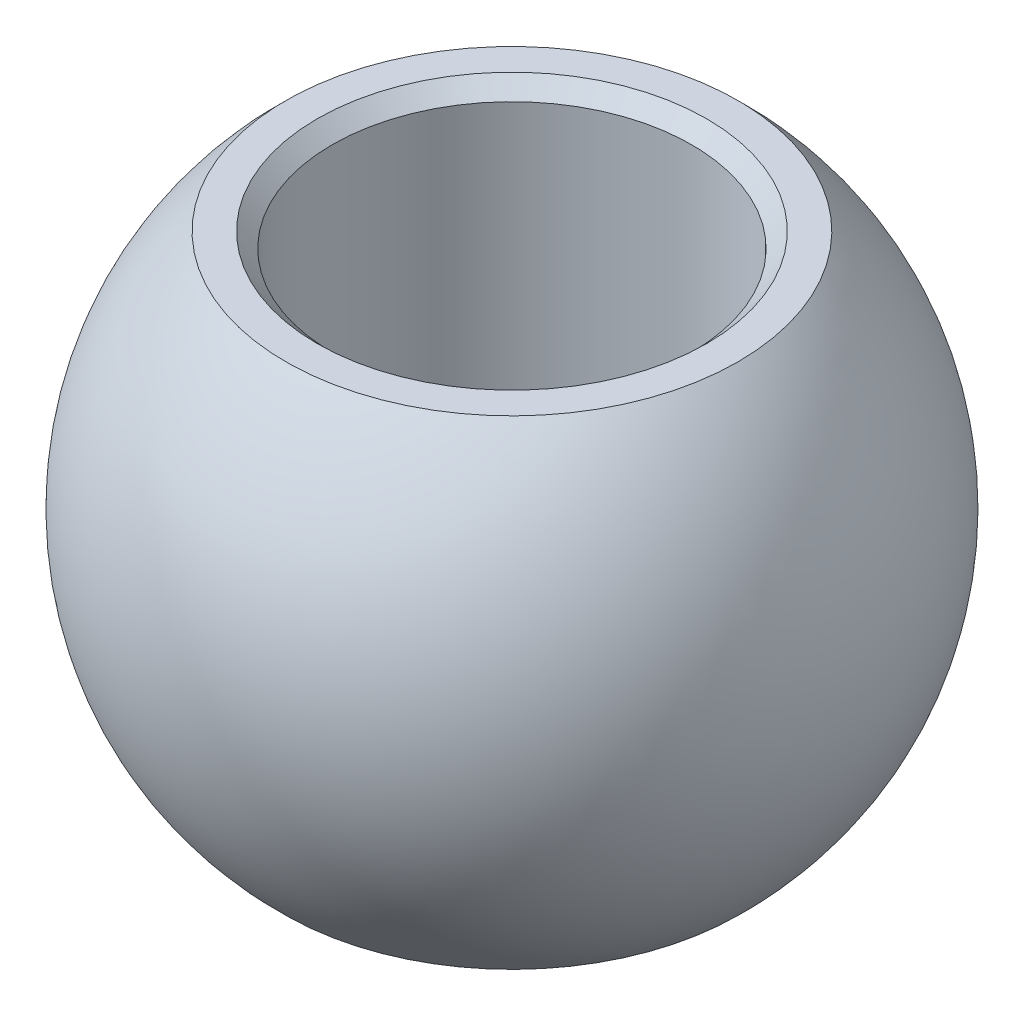
ISO-10303-21;
HEADER;
FILE_DESCRIPTION(('STEP AP214'),'2;1');
FILE_NAME('part.step','',(''),(''),'','','');
FILE_SCHEMA(('AUTOMOTIVE_DESIGN { 1 0 10303 214 1 1 1 1 }'));
ENDSEC;
DATA;
#1=APPLICATION_CONTEXT('core data for automotive mechanical design processes');
#2=APPLICATION_PROTOCOL_DEFINITION('international standard','automotive_design',2000,#1);
#3=PRODUCT_CONTEXT('',#1,'mechanical');
#4=PRODUCT('Part','Part','',(#3));
#5=PRODUCT_RELATED_PRODUCT_CATEGORY('part','',(#4));
#6=PRODUCT_DEFINITION_FORMATION('','',#4);
#7=PRODUCT_DEFINITION_CONTEXT('part definition',#1,'design');
#8=PRODUCT_DEFINITION('design','',#6,#7);
#9=PRODUCT_DEFINITION_SHAPE('','',#8);
#10=(LENGTH_UNIT() NAMED_UNIT(*) SI_UNIT(.MILLI.,.METRE.));
#11=(NAMED_UNIT(*) PLANE_ANGLE_UNIT() SI_UNIT($,.RADIAN.));
#12=(NAMED_UNIT(*) SI_UNIT($,.STERADIAN.) SOLID_ANGLE_UNIT());
#13=UNCERTAINTY_MEASURE_WITH_UNIT(LENGTH_MEASURE(1.E-05),#10,'distance_accuracy_value','');
#14=(GEOMETRIC_REPRESENTATION_CONTEXT(3) GLOBAL_UNCERTAINTY_ASSIGNED_CONTEXT((#13)) GLOBAL_UNIT_ASSIGNED_CONTEXT((#10,
#11,#12)) REPRESENTATION_CONTEXT('',''));
#15=CARTESIAN_POINT('',(0.,0.,0.));
#16=DIRECTION('',(0.,0.,1.));
#17=DIRECTION('',(1.,0.,0.));
#18=AXIS2_PLACEMENT_3D('',#15,#16,#17);
#19=CARTESIAN_POINT('',(0.,0.,0.));
#20=DIRECTION('',(0.,1.,0.));
#21=DIRECTION('',(1.,0.,0.));
#22=AXIS2_PLACEMENT_3D('',#19,#20,#21);
#23=SPHERICAL_SURFACE('',#22,7.33333333333333);
#24=CARTESIAN_POINT('',(0.,5.33333333333333,0.));
#25=DIRECTION('',(0.,1.,0.));
#26=DIRECTION('',(-1.,0.,0.));
#27=AXIS2_PLACEMENT_3D('',#24,#25,#26);
#28=CIRCLE('',#27,5.03322295684717);
#29=CARTESIAN_POINT('',(5.03322295684717,5.33333333333333,0.));
#30=VERTEX_POINT('',#29);
#31=EDGE_CURVE('E59',#30,#30,#28,.F.);
#32=CARTESIAN_POINT('',(0.,-5.33333333333334,0.));
#33=DIRECTION('',(0.,-1.,0.));
#34=DIRECTION('',(1.,0.,0.));
#35=AXIS2_PLACEMENT_3D('',#32,#33,#34);
#36=CIRCLE('',#35,5.03322295684716);
#37=CARTESIAN_POINT('',(5.03322295684716,-5.33333333333334,0.));
#38=VERTEX_POINT('',#37);
#39=EDGE_CURVE('E56',#38,#38,#36,.F.);
#40=CARTESIAN_POINT('',(5.03322295684717,5.33333333333333,0.));
#41=CARTESIAN_POINT('',(5.12370729712082,5.24794465436394,0.));
#42=CARTESIAN_POINT('',(5.21201444918314,5.1602493485395,0.));
#43=CARTESIAN_POINT('',(5.38405501510945,4.98048154321564,0.));
#44=CARTESIAN_POINT('',(5.46778842897344,4.88840904371623,0.));
#45=CARTESIAN_POINT('',(5.63046215672741,4.70012291107757,0.));
#46=CARTESIAN_POINT('',(5.70940247061739,4.60390927793834,0.));
#47=CARTESIAN_POINT('',(5.86228622410797,4.40759070061553,0.));
#48=CARTESIAN_POINT('',(5.93622966370857,4.30748575643195,0.));
#49=CARTESIAN_POINT('',(6.07892798509344,4.10364364368701,0.));
#50=CARTESIAN_POINT('',(6.14768286687771,3.99990647512565,0.));
#51=CARTESIAN_POINT('',(6.27982605466683,3.78906862536363,0.));
#52=CARTESIAN_POINT('',(6.34321436067168,3.68196794416298,0.));
#53=CARTESIAN_POINT('',(6.46446021660551,3.4646804334808,0.));
#54=CARTESIAN_POINT('',(6.52231776653449,3.35449360399926,0.));
#55=CARTESIAN_POINT('',(6.63235227031348,3.13131916949069,0.));
#56=CARTESIAN_POINT('',(6.68452922416349,3.01833156446365,0.));
#57=CARTESIAN_POINT('',(6.78306740339583,2.78984820104496,0.));
#58=CARTESIAN_POINT('',(6.82942862877816,2.67435244265331,0.));
#59=CARTESIAN_POINT('',(6.91621528183446,2.44115189159852,0.));
#60=CARTESIAN_POINT('',(6.95664070950845,2.32344709893537,0.));
#61=CARTESIAN_POINT('',(7.03145107052968,2.0861333192383,0.));
#62=CARTESIAN_POINT('',(7.06583600387693,1.96652433220438,0.));
#63=CARTESIAN_POINT('',(7.12847632379813,1.72571193536068,0.));
#64=CARTESIAN_POINT('',(7.15673171037209,1.6045085255509,0.));
#65=CARTESIAN_POINT('',(7.20703975899918,1.36082118407451,0.));
#66=CARTESIAN_POINT('',(7.22909242105232,1.2383372524079,0.));
#67=CARTESIAN_POINT('',(7.26693790713874,0.992406084526204,0.));
#68=CARTESIAN_POINT('',(7.28273073117203,0.868958848311121,0.));
#69=CARTESIAN_POINT('',(7.30801563987693,0.621420783471637,0.));
#70=CARTESIAN_POINT('',(7.31750772454855,0.497329954847236,0.));
#71=CARTESIAN_POINT('',(7.33016657127675,0.248826084148555,0.));
#72=CARTESIAN_POINT('',(7.33333333333333,0.124413042074274,0.));
#73=CARTESIAN_POINT('',(7.33333333333333,-0.124413042074287,0.));
#74=CARTESIAN_POINT('',(7.33016657127675,-0.248826084148568,0.));
#75=CARTESIAN_POINT('',(7.31750772454855,-0.497329954847249,0.));
#76=CARTESIAN_POINT('',(7.30801563987693,-0.62142078347165,0.));
#77=CARTESIAN_POINT('',(7.28273073117202,-0.868958848311134,0.));
#78=CARTESIAN_POINT('',(7.26693790713874,-0.992406084526217,0.));
#79=CARTESIAN_POINT('',(7.22909242105232,-1.23833725240791,0.));
#80=CARTESIAN_POINT('',(7.20703975899918,-1.36082118407452,0.));
#81=CARTESIAN_POINT('',(7.15673171037208,-1.60450852555091,0.));
#82=CARTESIAN_POINT('',(7.12847632379813,-1.72571193536069,0.));
#83=CARTESIAN_POINT('',(7.06583600387693,-1.96652433220439,0.));
#84=CARTESIAN_POINT('',(7.03145107052968,-2.08613331923832,0.));
#85=CARTESIAN_POINT('',(6.95664070950844,-2.32344709893539,0.));
#86=CARTESIAN_POINT('',(6.91621528183446,-2.44115189159853,0.));
#87=CARTESIAN_POINT('',(6.82942862877815,-2.67435244265332,0.));
#88=CARTESIAN_POINT('',(6.78306740339583,-2.78984820104497,0.));
#89=CARTESIAN_POINT('',(6.68452922416349,-3.01833156446366,0.));
#90=CARTESIAN_POINT('',(6.63235227031347,-3.1313191694907,0.));
#91=CARTESIAN_POINT('',(6.52231776653448,-3.35449360399928,0.));
#92=CARTESIAN_POINT('',(6.4644602166055,-3.46468043348081,0.));
#93=CARTESIAN_POINT('',(6.34321436067168,-3.68196794416299,0.));
#94=CARTESIAN_POINT('',(6.27982605466682,-3.78906862536365,0.));
#95=CARTESIAN_POINT('',(6.1476828668777,-3.99990647512566,0.));
#96=CARTESIAN_POINT('',(6.07892798509343,-4.10364364368702,0.));
#97=CARTESIAN_POINT('',(5.93622966370856,-4.30748575643196,0.));
#98=CARTESIAN_POINT('',(5.86228622410797,-4.40759070061554,0.));
#99=CARTESIAN_POINT('',(5.70940247061738,-4.60390927793835,0.));
#100=CARTESIAN_POINT('',(5.6304621567274,-4.70012291107758,0.));
#101=CARTESIAN_POINT('',(5.46778842897343,-4.88840904371624,0.));
#102=CARTESIAN_POINT('',(5.38405501510944,-4.98048154321565,0.));
#103=CARTESIAN_POINT('',(5.21201444918314,-5.16024934853951,0.));
#104=CARTESIAN_POINT('',(5.12370729712081,-5.24794465436395,0.));
#105=CARTESIAN_POINT('',(5.03322295684716,-5.33333333333334,0.));
#106=B_SPLINE_CURVE_WITH_KNOTS('',3,(#40,#41,#42,#43,#44,#45,#46,#47,#48,#49,#50,#51,#52,#53,
#54,#55,#56,#57,#58,#59,#60,#61,#62,#63,#64,#65,#66,#67,#68,#69,#70,#71,#72,#73,#74,#75,#76,#77,
#78,#79,#80,#81,#82,#83,#84,#85,#86,#87,#88,#89,#90,#91,#92,#93,#94,#95,#96,#97,#98,#99,#100,
#101,#102,#103,#104,#105),.UNSPECIFIED.,.F.,.F.,(4,2,2,2,2,2,2,2,2,2,2,2,2,2,2,2,2,2,2,2,2,2,2,
2,2,2,2,2,2,2,2,2,4),(0.,0.373198856067407,0.746397712134813,1.11959656820222,1.49279542426963,
1.86599428033703,2.23919313640444,2.61239199247185,2.98559084853925,3.35878970460666,
3.73198856067406,4.10518741674147,4.47838627280888,4.85158512887628,5.22478398494369,
5.5979828410111,5.9711816970785,6.34438055314591,6.71757940921332,7.09077826528072,
7.46397712134813,7.83717597741554,8.21037483348294,8.58357368955035,8.95677254561776,
9.32997140168516,9.70317025775257,10.07636911382,10.4495679698874,10.8227668259548,
11.1959656820222,11.5691645380896,11.942363394157),.UNSPECIFIED.);
#107=EDGE_CURVE('BSEAM36',#30,#38,#106,.T.);
#108=ORIENTED_EDGE('',*,*,#31,.T.);
#109=ORIENTED_EDGE('',*,*,#39,.T.);
#110=ORIENTED_EDGE('',*,*,#107,.T.);
#111=ORIENTED_EDGE('',*,*,#107,.F.);
#112=EDGE_LOOP('',(#108,#110,#109,#111));
#113=FACE_BOUND('',#112,.T.);
#114=ADVANCED_FACE('F36',(#113),#23,.T.);
#115=CARTESIAN_POINT('',(-17.8420348058902,5.33333333333332,-19.));
#116=DIRECTION('',(0.,1.,0.));
#117=DIRECTION('',(-1.,0.,0.));
#118=AXIS2_PLACEMENT_3D('',#115,#116,#117);
#119=PLANE('',#118);
#120=CARTESIAN_POINT('',(0.,5.33333333333333,0.));
#121=DIRECTION('',(0.,1.,0.));
#122=DIRECTION('',(-1.,0.,0.));
#123=AXIS2_PLACEMENT_3D('',#120,#121,#122);
#124=CIRCLE('',#123,4.33333333333334);
#125=CARTESIAN_POINT('',(-4.33333333333334,5.33333333333333,0.));
#126=VERTEX_POINT('',#125);
#127=EDGE_CURVE('E11',#126,#126,#124,.F.);
#128=ORIENTED_EDGE('',*,*,#127,.T.);
#129=EDGE_LOOP('',(#128));
#130=FACE_BOUND('',#129,.T.);
#131=ORIENTED_EDGE('',*,*,#31,.F.);
#132=EDGE_LOOP('',(#131));
#133=FACE_BOUND('',#132,.T.);
#134=ADVANCED_FACE('F65',(#130,#133),#119,.T.);
#135=CARTESIAN_POINT('',(-17.8420348058902,-5.33333333333334,-19.));
#136=DIRECTION('',(0.,-1.,0.));
#137=DIRECTION('',(1.,0.,0.));
#138=AXIS2_PLACEMENT_3D('',#135,#136,#137);
#139=PLANE('',#138);
#140=CARTESIAN_POINT('',(0.,-5.33333333333334,0.));
#141=DIRECTION('',(0.,-1.,0.));
#142=DIRECTION('',(1.,0.,0.));
#143=AXIS2_PLACEMENT_3D('',#140,#141,#142);
#144=CIRCLE('',#143,4.33333333333334);
#145=CARTESIAN_POINT('',(4.33333333333334,-5.33333333333334,0.));
#146=VERTEX_POINT('',#145);
#147=EDGE_CURVE('E43',#146,#146,#144,.F.);
#148=ORIENTED_EDGE('',*,*,#147,.T.);
#149=EDGE_LOOP('',(#148));
#150=FACE_BOUND('',#149,.T.);
#151=ORIENTED_EDGE('',*,*,#39,.F.);
#152=EDGE_LOOP('',(#151));
#153=FACE_BOUND('',#152,.T.);
#154=ADVANCED_FACE('F67',(#150,#153),#139,.T.);
#155=CARTESIAN_POINT('',(0.,-32.6666666666667,0.));
#156=DIRECTION('',(0.,1.,0.));
#157=DIRECTION('',(-1.,0.,0.));
#158=AXIS2_PLACEMENT_3D('',#155,#156,#157);
#159=CYLINDRICAL_SURFACE('',#158,4.);
#160=CARTESIAN_POINT('',(0.,-5.,0.));
#161=DIRECTION('',(0.,-1.,0.));
#162=DIRECTION('',(1.,0.,0.));
#163=AXIS2_PLACEMENT_3D('',#160,#161,#162);
#164=CIRCLE('',#163,4.);
#165=CARTESIAN_POINT('',(4.,-5.,0.));
#166=VERTEX_POINT('',#165);
#167=EDGE_CURVE('E47',#166,#166,#164,.T.);
#168=ORIENTED_EDGE('',*,*,#167,.T.);
#169=EDGE_LOOP('',(#168));
#170=FACE_BOUND('',#169,.T.);
#171=CARTESIAN_POINT('',(0.,4.99999999999999,0.));
#172=DIRECTION('',(0.,1.,0.));
#173=DIRECTION('',(-1.,0.,0.));
#174=AXIS2_PLACEMENT_3D('',#171,#172,#173);
#175=CIRCLE('',#174,4.);
#176=CARTESIAN_POINT('',(-4.,4.99999999999998,0.));
#177=VERTEX_POINT('',#176);
#178=EDGE_CURVE('E51',#177,#177,#175,.T.);
#179=ORIENTED_EDGE('',*,*,#178,.T.);
#180=EDGE_LOOP('',(#179));
#181=FACE_BOUND('',#180,.T.);
#182=ADVANCED_FACE('F73',(#170,#181),#159,.F.);
#183=CARTESIAN_POINT('',(0.,-5.,0.));
#184=DIRECTION('',(0.,-1.,0.));
#185=DIRECTION('',(1.,0.,0.));
#186=AXIS2_PLACEMENT_3D('',#183,#184,#185);
#187=CONICAL_SURFACE('',#186,4.,0.785398163397455);
#188=ORIENTED_EDGE('',*,*,#147,.F.);
#189=EDGE_LOOP('',(#188));
#190=FACE_BOUND('',#189,.T.);
#191=ORIENTED_EDGE('',*,*,#167,.F.);
#192=EDGE_LOOP('',(#191));
#193=FACE_BOUND('',#192,.T.);
#194=ADVANCED_FACE('F77',(#190,#193),#187,.F.);
#195=CARTESIAN_POINT('',(0.,4.99999999999999,0.));
#196=DIRECTION('',(0.,1.,0.));
#197=DIRECTION('',(-1.,0.,0.));
#198=AXIS2_PLACEMENT_3D('',#195,#196,#197);
#199=CONICAL_SURFACE('',#198,4.,0.785398163397444);
#200=ORIENTED_EDGE('',*,*,#127,.F.);
#201=EDGE_LOOP('',(#200));
#202=FACE_BOUND('',#201,.T.);
#203=ORIENTED_EDGE('',*,*,#178,.F.);
#204=EDGE_LOOP('',(#203));
#205=FACE_BOUND('',#204,.T.);
#206=ADVANCED_FACE('F38',(#202,#205),#199,.F.);
#207=CLOSED_SHELL('',(#114,#134,#154,#182,#194,#206));
#208=MANIFOLD_SOLID_BREP('B2',#207);
#209=ADVANCED_BREP_SHAPE_REPRESENTATION('',(#18,#208),#14);
#210=SHAPE_DEFINITION_REPRESENTATION(#9,#209);
ENDSEC;
END-ISO-10303-21;
